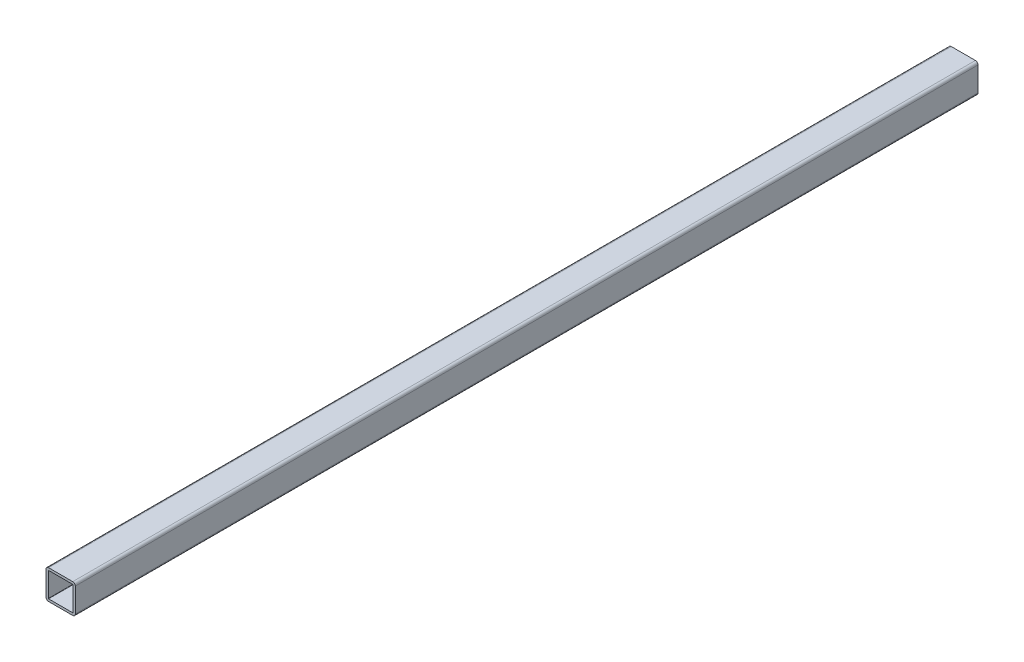
ISO-10303-21;
HEADER;
FILE_DESCRIPTION(('STEP AP214'),'2;1');
FILE_NAME('part.step','',(''),(''),'','','');
FILE_SCHEMA(('AUTOMOTIVE_DESIGN { 1 0 10303 214 1 1 1 1 }'));
ENDSEC;
DATA;
#1=APPLICATION_CONTEXT('core data for automotive mechanical design processes');
#2=APPLICATION_PROTOCOL_DEFINITION('international standard','automotive_design',2000,#1);
#3=PRODUCT_CONTEXT('',#1,'mechanical');
#4=PRODUCT('Part','Part','',(#3));
#5=PRODUCT_RELATED_PRODUCT_CATEGORY('part','',(#4));
#6=PRODUCT_DEFINITION_FORMATION('','',#4);
#7=PRODUCT_DEFINITION_CONTEXT('part definition',#1,'design');
#8=PRODUCT_DEFINITION('design','',#6,#7);
#9=PRODUCT_DEFINITION_SHAPE('','',#8);
#10=(LENGTH_UNIT() NAMED_UNIT(*) SI_UNIT(.MILLI.,.METRE.));
#11=(NAMED_UNIT(*) PLANE_ANGLE_UNIT() SI_UNIT($,.RADIAN.));
#12=(NAMED_UNIT(*) SI_UNIT($,.STERADIAN.) SOLID_ANGLE_UNIT());
#13=UNCERTAINTY_MEASURE_WITH_UNIT(LENGTH_MEASURE(1.E-05),#10,'distance_accuracy_value','');
#14=(GEOMETRIC_REPRESENTATION_CONTEXT(3) GLOBAL_UNCERTAINTY_ASSIGNED_CONTEXT((#13)) GLOBAL_UNIT_ASSIGNED_CONTEXT((#10,
#11,#12)) REPRESENTATION_CONTEXT('',''));
#15=CARTESIAN_POINT('',(0.,0.,0.));
#16=DIRECTION('',(0.,0.,1.));
#17=DIRECTION('',(1.,0.,0.));
#18=AXIS2_PLACEMENT_3D('',#15,#16,#17);
#19=CARTESIAN_POINT('',(-10.3,10.3,-770.));
#20=DIRECTION('',(0.,0.,1.));
#21=DIRECTION('',(1.,0.,0.));
#22=AXIS2_PLACEMENT_3D('',#19,#20,#21);
#23=CYLINDRICAL_SURFACE('',#22,2.2);
#24=CARTESIAN_POINT('',(-10.3,10.3,0.));
#25=DIRECTION('',(0.,0.,-1.));
#26=DIRECTION('',(-1.,0.,0.));
#27=AXIS2_PLACEMENT_3D('',#24,#25,#26);
#28=CIRCLE('',#27,2.2);
#29=CARTESIAN_POINT('',(-12.5,10.3,0.));
#30=VERTEX_POINT('',#29);
#31=CARTESIAN_POINT('',(-10.3,12.5,0.));
#32=VERTEX_POINT('',#31);
#33=EDGE_CURVE('E233',#30,#32,#28,.T.);
#34=ORIENTED_EDGE('',*,*,#33,.T.);
#35=DIRECTION('',(0.,0.,1.));
#36=VECTOR('',#35,1.);
#37=CARTESIAN_POINT('',(-10.3,12.5,-770.));
#38=LINE('',#37,#36);
#39=CARTESIAN_POINT('',(-10.3,12.5,-770.));
#40=VERTEX_POINT('',#39);
#41=EDGE_CURVE('E12',#40,#32,#38,.T.);
#42=ORIENTED_EDGE('',*,*,#41,.F.);
#43=CARTESIAN_POINT('',(-10.3,10.3,-770.));
#44=DIRECTION('',(0.,0.,-1.));
#45=DIRECTION('',(-1.,0.,0.));
#46=AXIS2_PLACEMENT_3D('',#43,#44,#45);
#47=CIRCLE('',#46,2.2);
#48=CARTESIAN_POINT('',(-12.5,10.3,-770.));
#49=VERTEX_POINT('',#48);
#50=EDGE_CURVE('E311',#49,#40,#47,.T.);
#51=ORIENTED_EDGE('',*,*,#50,.F.);
#52=DIRECTION('',(0.,0.,1.));
#53=VECTOR('',#52,1.);
#54=CARTESIAN_POINT('',(-12.5,10.3,-770.));
#55=LINE('',#54,#53);
#56=EDGE_CURVE('E248',#49,#30,#55,.T.);
#57=ORIENTED_EDGE('',*,*,#56,.T.);
#58=EDGE_LOOP('',(#34,#42,#51,#57));
#59=FACE_BOUND('',#58,.T.);
#60=ADVANCED_FACE('F61',(#59),#23,.T.);
#61=CARTESIAN_POINT('',(-10.3,12.5,-770.));
#62=DIRECTION('',(0.,-1.,0.));
#63=DIRECTION('',(0.,0.,-1.));
#64=AXIS2_PLACEMENT_3D('',#61,#62,#63);
#65=PLANE('',#64);
#66=DIRECTION('',(1.,0.,0.));
#67=VECTOR('',#66,1.);
#68=CARTESIAN_POINT('',(-10.3,12.5,0.));
#69=LINE('',#68,#67);
#70=CARTESIAN_POINT('',(10.3,12.5,0.));
#71=VERTEX_POINT('',#70);
#72=EDGE_CURVE('E236',#32,#71,#69,.T.);
#73=ORIENTED_EDGE('',*,*,#72,.T.);
#74=DIRECTION('',(0.,0.,1.));
#75=VECTOR('',#74,1.);
#76=CARTESIAN_POINT('',(10.3,12.5,-770.));
#77=LINE('',#76,#75);
#78=CARTESIAN_POINT('',(10.3,12.5,-770.));
#79=VERTEX_POINT('',#78);
#80=EDGE_CURVE('E71',#79,#71,#77,.T.);
#81=ORIENTED_EDGE('',*,*,#80,.F.);
#82=DIRECTION('',(1.,0.,0.));
#83=VECTOR('',#82,1.);
#84=CARTESIAN_POINT('',(-10.3,12.5,-770.));
#85=LINE('',#84,#83);
#86=EDGE_CURVE('E313',#40,#79,#85,.T.);
#87=ORIENTED_EDGE('',*,*,#86,.F.);
#88=ORIENTED_EDGE('',*,*,#41,.T.);
#89=EDGE_LOOP('',(#73,#81,#87,#88));
#90=FACE_BOUND('',#89,.T.);
#91=ADVANCED_FACE('F348',(#90),#65,.F.);
#92=CARTESIAN_POINT('',(10.3,10.3,-770.));
#93=DIRECTION('',(0.,0.,1.));
#94=DIRECTION('',(1.,0.,0.));
#95=AXIS2_PLACEMENT_3D('',#92,#93,#94);
#96=CYLINDRICAL_SURFACE('',#95,2.2);
#97=CARTESIAN_POINT('',(10.3,10.3,0.));
#98=DIRECTION('',(0.,0.,-1.));
#99=DIRECTION('',(-1.,0.,0.));
#100=AXIS2_PLACEMENT_3D('',#97,#98,#99);
#101=CIRCLE('',#100,2.2);
#102=CARTESIAN_POINT('',(12.5,10.3,0.));
#103=VERTEX_POINT('',#102);
#104=EDGE_CURVE('E238',#71,#103,#101,.T.);
#105=ORIENTED_EDGE('',*,*,#104,.T.);
#106=DIRECTION('',(0.,0.,1.));
#107=VECTOR('',#106,1.);
#108=CARTESIAN_POINT('',(12.5,10.3,-770.));
#109=LINE('',#108,#107);
#110=CARTESIAN_POINT('',(12.5,10.3,-770.));
#111=VERTEX_POINT('',#110);
#112=EDGE_CURVE('E255',#111,#103,#109,.T.);
#113=ORIENTED_EDGE('',*,*,#112,.F.);
#114=CARTESIAN_POINT('',(10.3,10.3,-770.));
#115=DIRECTION('',(0.,0.,-1.));
#116=DIRECTION('',(-1.,0.,0.));
#117=AXIS2_PLACEMENT_3D('',#114,#115,#116);
#118=CIRCLE('',#117,2.2);
#119=EDGE_CURVE('E315',#79,#111,#118,.T.);
#120=ORIENTED_EDGE('',*,*,#119,.F.);
#121=ORIENTED_EDGE('',*,*,#80,.T.);
#122=EDGE_LOOP('',(#105,#113,#120,#121));
#123=FACE_BOUND('',#122,.T.);
#124=ADVANCED_FACE('F353',(#123),#96,.T.);
#125=CARTESIAN_POINT('',(12.5,-10.3,-770.));
#126=DIRECTION('',(-1.,0.,0.));
#127=DIRECTION('',(0.,0.,1.));
#128=AXIS2_PLACEMENT_3D('',#125,#126,#127);
#129=PLANE('',#128);
#130=DIRECTION('',(0.,-1.,0.));
#131=VECTOR('',#130,1.);
#132=CARTESIAN_POINT('',(12.5,-10.3,0.));
#133=LINE('',#132,#131);
#134=CARTESIAN_POINT('',(12.5,-10.3,0.));
#135=VERTEX_POINT('',#134);
#136=EDGE_CURVE('E240',#103,#135,#133,.T.);
#137=ORIENTED_EDGE('',*,*,#136,.T.);
#138=DIRECTION('',(0.,0.,1.));
#139=VECTOR('',#138,1.);
#140=CARTESIAN_POINT('',(12.5,-10.3,-770.));
#141=LINE('',#140,#139);
#142=CARTESIAN_POINT('',(12.5,-10.3,-770.));
#143=VERTEX_POINT('',#142);
#144=EDGE_CURVE('E252',#143,#135,#141,.T.);
#145=ORIENTED_EDGE('',*,*,#144,.F.);
#146=DIRECTION('',(0.,-1.,0.));
#147=VECTOR('',#146,1.);
#148=CARTESIAN_POINT('',(12.5,-10.3,-770.));
#149=LINE('',#148,#147);
#150=EDGE_CURVE('E317',#111,#143,#149,.T.);
#151=ORIENTED_EDGE('',*,*,#150,.F.);
#152=ORIENTED_EDGE('',*,*,#112,.T.);
#153=EDGE_LOOP('',(#137,#145,#151,#152));
#154=FACE_BOUND('',#153,.T.);
#155=ADVANCED_FACE('F323',(#154),#129,.F.);
#156=CARTESIAN_POINT('',(10.3,-10.3,-770.));
#157=DIRECTION('',(0.,0.,1.));
#158=DIRECTION('',(1.,0.,0.));
#159=AXIS2_PLACEMENT_3D('',#156,#157,#158);
#160=CYLINDRICAL_SURFACE('',#159,2.2);
#161=CARTESIAN_POINT('',(10.3,-10.3,0.));
#162=DIRECTION('',(0.,0.,-1.));
#163=DIRECTION('',(-1.,0.,0.));
#164=AXIS2_PLACEMENT_3D('',#161,#162,#163);
#165=CIRCLE('',#164,2.2);
#166=CARTESIAN_POINT('',(10.3,-12.5,0.));
#167=VERTEX_POINT('',#166);
#168=EDGE_CURVE('E242',#135,#167,#165,.T.);
#169=ORIENTED_EDGE('',*,*,#168,.T.);
#170=DIRECTION('',(0.,0.,1.));
#171=VECTOR('',#170,1.);
#172=CARTESIAN_POINT('',(10.3,-12.5,-770.));
#173=LINE('',#172,#171);
#174=CARTESIAN_POINT('',(10.3,-12.5,-770.));
#175=VERTEX_POINT('',#174);
#176=EDGE_CURVE('E200',#175,#167,#173,.T.);
#177=ORIENTED_EDGE('',*,*,#176,.F.);
#178=CARTESIAN_POINT('',(10.3,-10.3,-770.));
#179=DIRECTION('',(0.,0.,-1.));
#180=DIRECTION('',(-1.,0.,0.));
#181=AXIS2_PLACEMENT_3D('',#178,#179,#180);
#182=CIRCLE('',#181,2.2);
#183=EDGE_CURVE('E191',#143,#175,#182,.T.);
#184=ORIENTED_EDGE('',*,*,#183,.F.);
#185=ORIENTED_EDGE('',*,*,#144,.T.);
#186=EDGE_LOOP('',(#169,#177,#184,#185));
#187=FACE_BOUND('',#186,.T.);
#188=ADVANCED_FACE('F327',(#187),#160,.T.);
#189=CARTESIAN_POINT('',(10.3,-12.5,-770.));
#190=DIRECTION('',(0.,1.,0.));
#191=DIRECTION('',(0.,0.,1.));
#192=AXIS2_PLACEMENT_3D('',#189,#190,#191);
#193=PLANE('',#192);
#194=DIRECTION('',(-1.,0.,0.));
#195=VECTOR('',#194,1.);
#196=CARTESIAN_POINT('',(10.3,-12.5,0.));
#197=LINE('',#196,#195);
#198=CARTESIAN_POINT('',(-10.3,-12.5,0.));
#199=VERTEX_POINT('',#198);
#200=EDGE_CURVE('E199',#167,#199,#197,.T.);
#201=ORIENTED_EDGE('',*,*,#200,.T.);
#202=DIRECTION('',(0.,0.,1.));
#203=VECTOR('',#202,1.);
#204=CARTESIAN_POINT('',(-10.3,-12.5,-770.));
#205=LINE('',#204,#203);
#206=CARTESIAN_POINT('',(-10.3,-12.5,-770.));
#207=VERTEX_POINT('',#206);
#208=EDGE_CURVE('E196',#207,#199,#205,.T.);
#209=ORIENTED_EDGE('',*,*,#208,.F.);
#210=DIRECTION('',(-1.,0.,0.));
#211=VECTOR('',#210,1.);
#212=CARTESIAN_POINT('',(10.3,-12.5,-770.));
#213=LINE('',#212,#211);
#214=EDGE_CURVE('E185',#175,#207,#213,.T.);
#215=ORIENTED_EDGE('',*,*,#214,.F.);
#216=ORIENTED_EDGE('',*,*,#176,.T.);
#217=EDGE_LOOP('',(#201,#209,#215,#216));
#218=FACE_BOUND('',#217,.T.);
#219=ADVANCED_FACE('F197',(#218),#193,.F.);
#220=CARTESIAN_POINT('',(-10.3,-10.3,-770.));
#221=DIRECTION('',(0.,0.,1.));
#222=DIRECTION('',(1.,0.,0.));
#223=AXIS2_PLACEMENT_3D('',#220,#221,#222);
#224=CYLINDRICAL_SURFACE('',#223,2.2);
#225=CARTESIAN_POINT('',(-10.3,-10.3,0.));
#226=DIRECTION('',(0.,0.,-1.));
#227=DIRECTION('',(-1.,0.,0.));
#228=AXIS2_PLACEMENT_3D('',#225,#226,#227);
#229=CIRCLE('',#228,2.2);
#230=CARTESIAN_POINT('',(-12.5,-10.3,0.));
#231=VERTEX_POINT('',#230);
#232=EDGE_CURVE('E133',#199,#231,#229,.T.);
#233=ORIENTED_EDGE('',*,*,#232,.T.);
#234=DIRECTION('',(0.,0.,1.));
#235=VECTOR('',#234,1.);
#236=CARTESIAN_POINT('',(-12.5,-10.3,-770.));
#237=LINE('',#236,#235);
#238=CARTESIAN_POINT('',(-12.5,-10.3,-770.));
#239=VERTEX_POINT('',#238);
#240=EDGE_CURVE('E201',#239,#231,#237,.T.);
#241=ORIENTED_EDGE('',*,*,#240,.F.);
#242=CARTESIAN_POINT('',(-10.3,-10.3,-770.));
#243=DIRECTION('',(0.,0.,-1.));
#244=DIRECTION('',(-1.,0.,0.));
#245=AXIS2_PLACEMENT_3D('',#242,#243,#244);
#246=CIRCLE('',#245,2.2);
#247=EDGE_CURVE('E189',#207,#239,#246,.T.);
#248=ORIENTED_EDGE('',*,*,#247,.F.);
#249=ORIENTED_EDGE('',*,*,#208,.T.);
#250=EDGE_LOOP('',(#233,#241,#248,#249));
#251=FACE_BOUND('',#250,.T.);
#252=ADVANCED_FACE('F203',(#251),#224,.T.);
#253=CARTESIAN_POINT('',(10.3,10.3,-770.));
#254=DIRECTION('',(0.,0.,1.));
#255=DIRECTION('',(1.,0.,0.));
#256=AXIS2_PLACEMENT_3D('',#253,#254,#255);
#257=CYLINDRICAL_SURFACE('',#256,0.200000000000001);
#258=CARTESIAN_POINT('',(10.3,10.3,0.));
#259=DIRECTION('',(0.,0.,-1.));
#260=DIRECTION('',(-1.,0.,0.));
#261=AXIS2_PLACEMENT_3D('',#258,#259,#260);
#262=CIRCLE('',#261,0.200000000000001);
#263=CARTESIAN_POINT('',(10.3,10.5,0.));
#264=VERTEX_POINT('',#263);
#265=CARTESIAN_POINT('',(10.5,10.3,0.));
#266=VERTEX_POINT('',#265);
#267=EDGE_CURVE('E209',#264,#266,#262,.T.);
#268=ORIENTED_EDGE('',*,*,#267,.F.);
#269=DIRECTION('',(0.,0.,1.));
#270=VECTOR('',#269,1.);
#271=CARTESIAN_POINT('',(10.3,10.5,-770.));
#272=LINE('',#271,#270);
#273=CARTESIAN_POINT('',(10.3,10.5,-770.));
#274=VERTEX_POINT('',#273);
#275=EDGE_CURVE('E65',#274,#264,#272,.T.);
#276=ORIENTED_EDGE('',*,*,#275,.F.);
#277=CARTESIAN_POINT('',(10.3,10.3,-770.));
#278=DIRECTION('',(0.,0.,-1.));
#279=DIRECTION('',(-1.,0.,0.));
#280=AXIS2_PLACEMENT_3D('',#277,#278,#279);
#281=CIRCLE('',#280,0.200000000000001);
#282=CARTESIAN_POINT('',(10.5,10.3,-770.));
#283=VERTEX_POINT('',#282);
#284=EDGE_CURVE('E247',#274,#283,#281,.T.);
#285=ORIENTED_EDGE('',*,*,#284,.T.);
#286=DIRECTION('',(0.,0.,1.));
#287=VECTOR('',#286,1.);
#288=CARTESIAN_POINT('',(10.5,10.3,-770.));
#289=LINE('',#288,#287);
#290=EDGE_CURVE('E205',#283,#266,#289,.T.);
#291=ORIENTED_EDGE('',*,*,#290,.T.);
#292=EDGE_LOOP('',(#268,#276,#285,#291));
#293=FACE_BOUND('',#292,.T.);
#294=ADVANCED_FACE('F63',(#293),#257,.F.);
#295=CARTESIAN_POINT('',(-10.3,10.5,-770.));
#296=DIRECTION('',(0.,-1.,0.));
#297=DIRECTION('',(0.,0.,-1.));
#298=AXIS2_PLACEMENT_3D('',#295,#296,#297);
#299=PLANE('',#298);
#300=DIRECTION('',(1.,0.,0.));
#301=VECTOR('',#300,1.);
#302=CARTESIAN_POINT('',(-10.3,10.5,0.));
#303=LINE('',#302,#301);
#304=CARTESIAN_POINT('',(-10.3,10.5,0.));
#305=VERTEX_POINT('',#304);
#306=EDGE_CURVE('E212',#305,#264,#303,.T.);
#307=ORIENTED_EDGE('',*,*,#306,.F.);
#308=DIRECTION('',(0.,0.,1.));
#309=VECTOR('',#308,1.);
#310=CARTESIAN_POINT('',(-10.3,10.5,-770.));
#311=LINE('',#310,#309);
#312=CARTESIAN_POINT('',(-10.3,10.5,-770.));
#313=VERTEX_POINT('',#312);
#314=EDGE_CURVE('E270',#313,#305,#311,.T.);
#315=ORIENTED_EDGE('',*,*,#314,.F.);
#316=DIRECTION('',(1.,0.,0.));
#317=VECTOR('',#316,1.);
#318=CARTESIAN_POINT('',(-10.3,10.5,-770.));
#319=LINE('',#318,#317);
#320=EDGE_CURVE('E279',#313,#274,#319,.T.);
#321=ORIENTED_EDGE('',*,*,#320,.T.);
#322=ORIENTED_EDGE('',*,*,#275,.T.);
#323=EDGE_LOOP('',(#307,#315,#321,#322));
#324=FACE_BOUND('',#323,.T.);
#325=ADVANCED_FACE('F277',(#324),#299,.T.);
#326=CARTESIAN_POINT('',(-10.3,10.3,-770.));
#327=DIRECTION('',(0.,0.,1.));
#328=DIRECTION('',(1.,0.,0.));
#329=AXIS2_PLACEMENT_3D('',#326,#327,#328);
#330=CYLINDRICAL_SURFACE('',#329,0.2);
#331=CARTESIAN_POINT('',(-10.3,10.3,0.));
#332=DIRECTION('',(0.,0.,-1.));
#333=DIRECTION('',(-1.,0.,0.));
#334=AXIS2_PLACEMENT_3D('',#331,#332,#333);
#335=CIRCLE('',#334,0.2);
#336=CARTESIAN_POINT('',(-10.5,10.3,0.));
#337=VERTEX_POINT('',#336);
#338=EDGE_CURVE('E215',#337,#305,#335,.T.);
#339=ORIENTED_EDGE('',*,*,#338,.F.);
#340=DIRECTION('',(0.,0.,1.));
#341=VECTOR('',#340,1.);
#342=CARTESIAN_POINT('',(-10.5,10.3,-770.));
#343=LINE('',#342,#341);
#344=CARTESIAN_POINT('',(-10.5,10.3,-770.));
#345=VERTEX_POINT('',#344);
#346=EDGE_CURVE('E269',#345,#337,#343,.T.);
#347=ORIENTED_EDGE('',*,*,#346,.F.);
#348=CARTESIAN_POINT('',(-10.3,10.3,-770.));
#349=DIRECTION('',(0.,0.,-1.));
#350=DIRECTION('',(-1.,0.,0.));
#351=AXIS2_PLACEMENT_3D('',#348,#349,#350);
#352=CIRCLE('',#351,0.2);
#353=EDGE_CURVE('E287',#345,#313,#352,.T.);
#354=ORIENTED_EDGE('',*,*,#353,.T.);
#355=ORIENTED_EDGE('',*,*,#314,.T.);
#356=EDGE_LOOP('',(#339,#347,#354,#355));
#357=FACE_BOUND('',#356,.T.);
#358=ADVANCED_FACE('F285',(#357),#330,.F.);
#359=CARTESIAN_POINT('',(-10.5,10.3,-770.));
#360=DIRECTION('',(1.,0.,0.));
#361=DIRECTION('',(0.,0.,-1.));
#362=AXIS2_PLACEMENT_3D('',#359,#360,#361);
#363=PLANE('',#362);
#364=DIRECTION('',(0.,1.,0.));
#365=VECTOR('',#364,1.);
#366=CARTESIAN_POINT('',(-10.5,10.3,0.));
#367=LINE('',#366,#365);
#368=CARTESIAN_POINT('',(-10.5,-10.3,0.));
#369=VERTEX_POINT('',#368);
#370=EDGE_CURVE('E218',#369,#337,#367,.T.);
#371=ORIENTED_EDGE('',*,*,#370,.F.);
#372=DIRECTION('',(0.,0.,1.));
#373=VECTOR('',#372,1.);
#374=CARTESIAN_POINT('',(-10.5,-10.3,-770.));
#375=LINE('',#374,#373);
#376=CARTESIAN_POINT('',(-10.5,-10.3,-770.));
#377=VERTEX_POINT('',#376);
#378=EDGE_CURVE('E267',#377,#369,#375,.T.);
#379=ORIENTED_EDGE('',*,*,#378,.F.);
#380=DIRECTION('',(0.,1.,0.));
#381=VECTOR('',#380,1.);
#382=CARTESIAN_POINT('',(-10.5,10.3,-770.));
#383=LINE('',#382,#381);
#384=EDGE_CURVE('E293',#377,#345,#383,.T.);
#385=ORIENTED_EDGE('',*,*,#384,.T.);
#386=ORIENTED_EDGE('',*,*,#346,.T.);
#387=EDGE_LOOP('',(#371,#379,#385,#386));
#388=FACE_BOUND('',#387,.T.);
#389=ADVANCED_FACE('F296',(#388),#363,.T.);
#390=CARTESIAN_POINT('',(-10.3,-10.3,-770.));
#391=DIRECTION('',(0.,0.,1.));
#392=DIRECTION('',(1.,0.,0.));
#393=AXIS2_PLACEMENT_3D('',#390,#391,#392);
#394=CYLINDRICAL_SURFACE('',#393,0.2);
#395=CARTESIAN_POINT('',(-10.3,-10.3,0.));
#396=DIRECTION('',(0.,0.,-1.));
#397=DIRECTION('',(-1.,0.,0.));
#398=AXIS2_PLACEMENT_3D('',#395,#396,#397);
#399=CIRCLE('',#398,0.2);
#400=CARTESIAN_POINT('',(-10.3,-10.5,0.));
#401=VERTEX_POINT('',#400);
#402=EDGE_CURVE('E221',#401,#369,#399,.T.);
#403=ORIENTED_EDGE('',*,*,#402,.F.);
#404=DIRECTION('',(0.,0.,1.));
#405=VECTOR('',#404,1.);
#406=CARTESIAN_POINT('',(-10.3,-10.5,-770.));
#407=LINE('',#406,#405);
#408=CARTESIAN_POINT('',(-10.3,-10.5,-770.));
#409=VERTEX_POINT('',#408);
#410=EDGE_CURVE('E265',#409,#401,#407,.T.);
#411=ORIENTED_EDGE('',*,*,#410,.F.);
#412=CARTESIAN_POINT('',(-10.3,-10.3,-770.));
#413=DIRECTION('',(0.,0.,-1.));
#414=DIRECTION('',(-1.,0.,0.));
#415=AXIS2_PLACEMENT_3D('',#412,#413,#414);
#416=CIRCLE('',#415,0.2);
#417=EDGE_CURVE('E297',#409,#377,#416,.T.);
#418=ORIENTED_EDGE('',*,*,#417,.T.);
#419=ORIENTED_EDGE('',*,*,#378,.T.);
#420=EDGE_LOOP('',(#403,#411,#418,#419));
#421=FACE_BOUND('',#420,.T.);
#422=ADVANCED_FACE('F364',(#421),#394,.F.);
#423=CARTESIAN_POINT('',(10.3,-10.5,-770.));
#424=DIRECTION('',(0.,1.,0.));
#425=DIRECTION('',(0.,0.,1.));
#426=AXIS2_PLACEMENT_3D('',#423,#424,#425);
#427=PLANE('',#426);
#428=DIRECTION('',(-1.,0.,0.));
#429=VECTOR('',#428,1.);
#430=CARTESIAN_POINT('',(10.3,-10.5,0.));
#431=LINE('',#430,#429);
#432=CARTESIAN_POINT('',(10.3,-10.5,0.));
#433=VERTEX_POINT('',#432);
#434=EDGE_CURVE('E224',#433,#401,#431,.T.);
#435=ORIENTED_EDGE('',*,*,#434,.F.);
#436=DIRECTION('',(0.,0.,1.));
#437=VECTOR('',#436,1.);
#438=CARTESIAN_POINT('',(10.3,-10.5,-770.));
#439=LINE('',#438,#437);
#440=CARTESIAN_POINT('',(10.3,-10.5,-770.));
#441=VERTEX_POINT('',#440);
#442=EDGE_CURVE('E263',#441,#433,#439,.T.);
#443=ORIENTED_EDGE('',*,*,#442,.F.);
#444=DIRECTION('',(-1.,0.,0.));
#445=VECTOR('',#444,1.);
#446=CARTESIAN_POINT('',(10.3,-10.5,-770.));
#447=LINE('',#446,#445);
#448=EDGE_CURVE('E299',#441,#409,#447,.T.);
#449=ORIENTED_EDGE('',*,*,#448,.T.);
#450=ORIENTED_EDGE('',*,*,#410,.T.);
#451=EDGE_LOOP('',(#435,#443,#449,#450));
#452=FACE_BOUND('',#451,.T.);
#453=ADVANCED_FACE('F360',(#452),#427,.T.);
#454=CARTESIAN_POINT('',(10.3,-10.3,-770.));
#455=DIRECTION('',(0.,0.,1.));
#456=DIRECTION('',(1.,0.,0.));
#457=AXIS2_PLACEMENT_3D('',#454,#455,#456);
#458=CYLINDRICAL_SURFACE('',#457,0.199999999999999);
#459=CARTESIAN_POINT('',(10.3,-10.3,0.));
#460=DIRECTION('',(0.,0.,-1.));
#461=DIRECTION('',(-1.,0.,0.));
#462=AXIS2_PLACEMENT_3D('',#459,#460,#461);
#463=CIRCLE('',#462,0.199999999999999);
#464=CARTESIAN_POINT('',(10.5,-10.3,0.));
#465=VERTEX_POINT('',#464);
#466=EDGE_CURVE('E227',#465,#433,#463,.T.);
#467=ORIENTED_EDGE('',*,*,#466,.F.);
#468=DIRECTION('',(0.,0.,1.));
#469=VECTOR('',#468,1.);
#470=CARTESIAN_POINT('',(10.5,-10.3,-770.));
#471=LINE('',#470,#469);
#472=CARTESIAN_POINT('',(10.5,-10.3,-770.));
#473=VERTEX_POINT('',#472);
#474=EDGE_CURVE('E261',#473,#465,#471,.T.);
#475=ORIENTED_EDGE('',*,*,#474,.F.);
#476=CARTESIAN_POINT('',(10.3,-10.3,-770.));
#477=DIRECTION('',(0.,0.,-1.));
#478=DIRECTION('',(-1.,0.,0.));
#479=AXIS2_PLACEMENT_3D('',#476,#477,#478);
#480=CIRCLE('',#479,0.199999999999999);
#481=EDGE_CURVE('E305',#473,#441,#480,.T.);
#482=ORIENTED_EDGE('',*,*,#481,.T.);
#483=ORIENTED_EDGE('',*,*,#442,.T.);
#484=EDGE_LOOP('',(#467,#475,#482,#483));
#485=FACE_BOUND('',#484,.T.);
#486=ADVANCED_FACE('F342',(#485),#458,.F.);
#487=CARTESIAN_POINT('',(10.5,-10.3,-770.));
#488=DIRECTION('',(-1.,0.,0.));
#489=DIRECTION('',(0.,0.,1.));
#490=AXIS2_PLACEMENT_3D('',#487,#488,#489);
#491=PLANE('',#490);
#492=DIRECTION('',(0.,-1.,0.));
#493=VECTOR('',#492,1.);
#494=CARTESIAN_POINT('',(10.5,-10.3,0.));
#495=LINE('',#494,#493);
#496=EDGE_CURVE('E230',#266,#465,#495,.T.);
#497=ORIENTED_EDGE('',*,*,#496,.F.);
#498=ORIENTED_EDGE('',*,*,#290,.F.);
#499=DIRECTION('',(0.,-1.,0.));
#500=VECTOR('',#499,1.);
#501=CARTESIAN_POINT('',(10.5,-10.3,-770.));
#502=LINE('',#501,#500);
#503=EDGE_CURVE('E308',#283,#473,#502,.T.);
#504=ORIENTED_EDGE('',*,*,#503,.T.);
#505=ORIENTED_EDGE('',*,*,#474,.T.);
#506=EDGE_LOOP('',(#497,#498,#504,#505));
#507=FACE_BOUND('',#506,.T.);
#508=ADVANCED_FACE('F335',(#507),#491,.T.);
#509=CARTESIAN_POINT('',(-12.5,10.3,-770.));
#510=DIRECTION('',(1.,0.,0.));
#511=DIRECTION('',(0.,0.,-1.));
#512=AXIS2_PLACEMENT_3D('',#509,#510,#511);
#513=PLANE('',#512);
#514=DIRECTION('',(0.,1.,0.));
#515=VECTOR('',#514,1.);
#516=CARTESIAN_POINT('',(-12.5,10.3,0.));
#517=LINE('',#516,#515);
#518=EDGE_CURVE('E139',#231,#30,#517,.T.);
#519=ORIENTED_EDGE('',*,*,#518,.T.);
#520=ORIENTED_EDGE('',*,*,#56,.F.);
#521=DIRECTION('',(0.,1.,0.));
#522=VECTOR('',#521,1.);
#523=CARTESIAN_POINT('',(-12.5,10.3,-770.));
#524=LINE('',#523,#522);
#525=EDGE_CURVE('E80',#239,#49,#524,.T.);
#526=ORIENTED_EDGE('',*,*,#525,.F.);
#527=ORIENTED_EDGE('',*,*,#240,.T.);
#528=EDGE_LOOP('',(#519,#520,#526,#527));
#529=FACE_BOUND('',#528,.T.);
#530=ADVANCED_FACE('F333',(#529),#513,.F.);
#531=CARTESIAN_POINT('',(-10.3,10.3,-770.));
#532=DIRECTION('',(0.,0.,-1.));
#533=DIRECTION('',(-1.,0.,0.));
#534=AXIS2_PLACEMENT_3D('',#531,#532,#533);
#535=PLANE('',#534);
#536=ORIENTED_EDGE('',*,*,#284,.F.);
#537=ORIENTED_EDGE('',*,*,#320,.F.);
#538=ORIENTED_EDGE('',*,*,#353,.F.);
#539=ORIENTED_EDGE('',*,*,#384,.F.);
#540=ORIENTED_EDGE('',*,*,#417,.F.);
#541=ORIENTED_EDGE('',*,*,#448,.F.);
#542=ORIENTED_EDGE('',*,*,#481,.F.);
#543=ORIENTED_EDGE('',*,*,#503,.F.);
#544=EDGE_LOOP('',(#536,#537,#538,#539,#540,#541,#542,#543));
#545=FACE_BOUND('',#544,.T.);
#546=ORIENTED_EDGE('',*,*,#50,.T.);
#547=ORIENTED_EDGE('',*,*,#86,.T.);
#548=ORIENTED_EDGE('',*,*,#119,.T.);
#549=ORIENTED_EDGE('',*,*,#150,.T.);
#550=ORIENTED_EDGE('',*,*,#183,.T.);
#551=ORIENTED_EDGE('',*,*,#214,.T.);
#552=ORIENTED_EDGE('',*,*,#247,.T.);
#553=ORIENTED_EDGE('',*,*,#525,.T.);
#554=EDGE_LOOP('',(#546,#547,#548,#549,#550,#551,#552,#553));
#555=FACE_BOUND('',#554,.T.);
#556=ADVANCED_FACE('F187',(#545,#555),#535,.T.);
#557=CARTESIAN_POINT('',(-10.3,10.3,0.));
#558=DIRECTION('',(0.,0.,-1.));
#559=DIRECTION('',(-1.,0.,0.));
#560=AXIS2_PLACEMENT_3D('',#557,#558,#559);
#561=PLANE('',#560);
#562=ORIENTED_EDGE('',*,*,#267,.T.);
#563=ORIENTED_EDGE('',*,*,#496,.T.);
#564=ORIENTED_EDGE('',*,*,#466,.T.);
#565=ORIENTED_EDGE('',*,*,#434,.T.);
#566=ORIENTED_EDGE('',*,*,#402,.T.);
#567=ORIENTED_EDGE('',*,*,#370,.T.);
#568=ORIENTED_EDGE('',*,*,#338,.T.);
#569=ORIENTED_EDGE('',*,*,#306,.T.);
#570=EDGE_LOOP('',(#562,#563,#564,#565,#566,#567,#568,#569));
#571=FACE_BOUND('',#570,.T.);
#572=ORIENTED_EDGE('',*,*,#33,.F.);
#573=ORIENTED_EDGE('',*,*,#518,.F.);
#574=ORIENTED_EDGE('',*,*,#232,.F.);
#575=ORIENTED_EDGE('',*,*,#200,.F.);
#576=ORIENTED_EDGE('',*,*,#168,.F.);
#577=ORIENTED_EDGE('',*,*,#136,.F.);
#578=ORIENTED_EDGE('',*,*,#104,.F.);
#579=ORIENTED_EDGE('',*,*,#72,.F.);
#580=EDGE_LOOP('',(#572,#573,#574,#575,#576,#577,#578,#579));
#581=FACE_BOUND('',#580,.T.);
#582=ADVANCED_FACE('F282',(#571,#581),#561,.F.);
#583=CLOSED_SHELL('',(#60,#91,#124,#155,#188,#219,#252,#294,#325,#358,#389,#422,#453,#486,#508,
#530,#556,#582));
#584=MANIFOLD_SOLID_BREP('B2',#583);
#585=ADVANCED_BREP_SHAPE_REPRESENTATION('',(#18,#584),#14);
#586=SHAPE_DEFINITION_REPRESENTATION(#9,#585);
ENDSEC;
END-ISO-10303-21;
